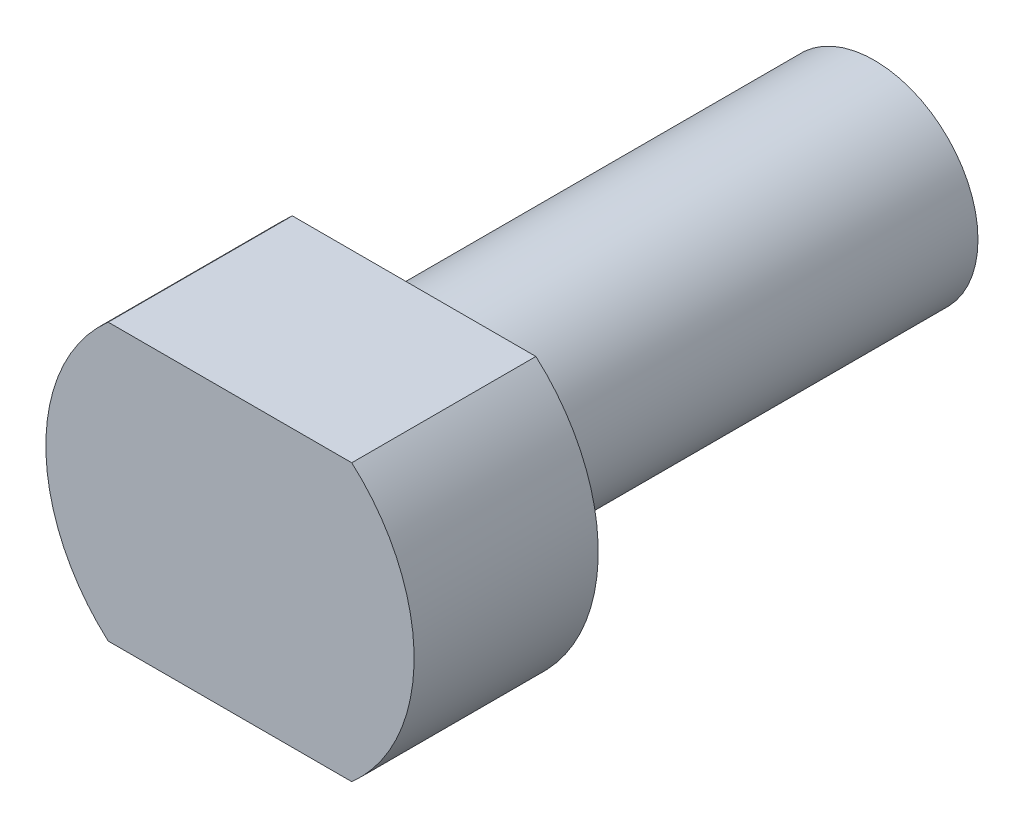
ISO-10303-21;
HEADER;
FILE_DESCRIPTION(('STEP AP214'),'2;1');
FILE_NAME('part.step','',(''),(''),'','','');
FILE_SCHEMA(('AUTOMOTIVE_DESIGN { 1 0 10303 214 1 1 1 1 }'));
ENDSEC;
DATA;
#1=APPLICATION_CONTEXT('core data for automotive mechanical design processes');
#2=APPLICATION_PROTOCOL_DEFINITION('international standard','automotive_design',2000,#1);
#3=PRODUCT_CONTEXT('',#1,'mechanical');
#4=PRODUCT('Part','Part','',(#3));
#5=PRODUCT_RELATED_PRODUCT_CATEGORY('part','',(#4));
#6=PRODUCT_DEFINITION_FORMATION('','',#4);
#7=PRODUCT_DEFINITION_CONTEXT('part definition',#1,'design');
#8=PRODUCT_DEFINITION('design','',#6,#7);
#9=PRODUCT_DEFINITION_SHAPE('','',#8);
#10=(LENGTH_UNIT() NAMED_UNIT(*) SI_UNIT(.MILLI.,.METRE.));
#11=(NAMED_UNIT(*) PLANE_ANGLE_UNIT() SI_UNIT($,.RADIAN.));
#12=(NAMED_UNIT(*) SI_UNIT($,.STERADIAN.) SOLID_ANGLE_UNIT());
#13=UNCERTAINTY_MEASURE_WITH_UNIT(LENGTH_MEASURE(1.E-05),#10,'distance_accuracy_value','');
#14=(GEOMETRIC_REPRESENTATION_CONTEXT(3) GLOBAL_UNCERTAINTY_ASSIGNED_CONTEXT((#13)) GLOBAL_UNIT_ASSIGNED_CONTEXT((#10,
#11,#12)) REPRESENTATION_CONTEXT('',''));
#15=CARTESIAN_POINT('',(0.,0.,0.));
#16=DIRECTION('',(0.,0.,1.));
#17=DIRECTION('',(1.,0.,0.));
#18=AXIS2_PLACEMENT_3D('',#15,#16,#17);
#19=CARTESIAN_POINT('',(0.,0.,14.));
#20=DIRECTION('',(0.,0.,-1.));
#21=DIRECTION('',(-1.,0.,0.));
#22=AXIS2_PLACEMENT_3D('',#19,#20,#21);
#23=CYLINDRICAL_SURFACE('',#22,4.);
#24=CARTESIAN_POINT('',(0.,0.,14.));
#25=DIRECTION('',(0.,0.,1.));
#26=DIRECTION('',(1.,0.,0.));
#27=AXIS2_PLACEMENT_3D('',#24,#25,#26);
#28=CIRCLE('',#27,4.);
#29=CARTESIAN_POINT('',(-2.64575131106459,3.,14.));
#30=VERTEX_POINT('',#29);
#31=CARTESIAN_POINT('',(-2.64575131106459,-3.,14.));
#32=VERTEX_POINT('',#31);
#33=EDGE_CURVE('E91',#30,#32,#28,.T.);
#34=ORIENTED_EDGE('',*,*,#33,.F.);
#35=DIRECTION('',(0.,0.,1.));
#36=VECTOR('',#35,1.);
#37=CARTESIAN_POINT('',(-2.64575131106459,3.,10.));
#38=LINE('',#37,#36);
#39=CARTESIAN_POINT('',(-2.64575131106459,3.,10.));
#40=VERTEX_POINT('',#39);
#41=EDGE_CURVE('E76',#40,#30,#38,.T.);
#42=ORIENTED_EDGE('',*,*,#41,.F.);
#43=CARTESIAN_POINT('',(0.,0.,10.));
#44=DIRECTION('',(0.,0.,1.));
#45=DIRECTION('',(1.,0.,0.));
#46=AXIS2_PLACEMENT_3D('',#43,#44,#45);
#47=CIRCLE('',#46,4.);
#48=CARTESIAN_POINT('',(-2.64575131106459,-3.,10.));
#49=VERTEX_POINT('',#48);
#50=EDGE_CURVE('E98',#40,#49,#47,.T.);
#51=ORIENTED_EDGE('',*,*,#50,.T.);
#52=DIRECTION('',(0.,0.,1.));
#53=VECTOR('',#52,1.);
#54=CARTESIAN_POINT('',(-2.64575131106459,-3.,10.));
#55=LINE('',#54,#53);
#56=EDGE_CURVE('E52',#49,#32,#55,.T.);
#57=ORIENTED_EDGE('',*,*,#56,.T.);
#58=EDGE_LOOP('',(#34,#42,#51,#57));
#59=FACE_BOUND('',#58,.T.);
#60=ADVANCED_FACE('F37',(#59),#23,.T.);
#61=CARTESIAN_POINT('',(0.,0.,10.));
#62=DIRECTION('',(0.,0.,-1.));
#63=DIRECTION('',(-1.,0.,0.));
#64=AXIS2_PLACEMENT_3D('',#61,#62,#63);
#65=CYLINDRICAL_SURFACE('',#64,2.25);
#66=CARTESIAN_POINT('',(0.,0.,10.));
#67=DIRECTION('',(0.,0.,1.));
#68=DIRECTION('',(1.,0.,0.));
#69=AXIS2_PLACEMENT_3D('',#66,#67,#68);
#70=CIRCLE('',#69,2.25);
#71=CARTESIAN_POINT('',(2.25,0.,10.));
#72=VERTEX_POINT('',#71);
#73=EDGE_CURVE('E12',#72,#72,#70,.T.);
#74=ORIENTED_EDGE('',*,*,#73,.F.);
#75=EDGE_LOOP('',(#74));
#76=FACE_BOUND('',#75,.T.);
#77=CARTESIAN_POINT('',(0.,0.,0.));
#78=DIRECTION('',(0.,0.,1.));
#79=DIRECTION('',(1.,0.,0.));
#80=AXIS2_PLACEMENT_3D('',#77,#78,#79);
#81=CIRCLE('',#80,2.25);
#82=CARTESIAN_POINT('',(2.25,0.,0.));
#83=VERTEX_POINT('',#82);
#84=EDGE_CURVE('E41',#83,#83,#81,.T.);
#85=ORIENTED_EDGE('',*,*,#84,.T.);
#86=EDGE_LOOP('',(#85));
#87=FACE_BOUND('',#86,.T.);
#88=ADVANCED_FACE('F39',(#76,#87),#65,.T.);
#89=CARTESIAN_POINT('',(0.,0.,0.));
#90=DIRECTION('',(0.,0.,1.));
#91=DIRECTION('',(1.,0.,0.));
#92=AXIS2_PLACEMENT_3D('',#89,#90,#91);
#93=PLANE('',#92);
#94=ORIENTED_EDGE('',*,*,#84,.F.);
#95=EDGE_LOOP('',(#94));
#96=FACE_BOUND('',#95,.T.);
#97=ADVANCED_FACE('F118',(#96),#93,.F.);
#98=CARTESIAN_POINT('',(2.64575131106459,-3.,10.));
#99=VERTEX_POINT('',#98);
#100=CARTESIAN_POINT('',(2.64575131106459,3.,10.));
#101=VERTEX_POINT('',#100);
#102=EDGE_CURVE('E103',#99,#101,#47,.T.);
#103=ORIENTED_EDGE('',*,*,#102,.T.);
#104=DIRECTION('',(0.,0.,1.));
#105=VECTOR('',#104,1.);
#106=CARTESIAN_POINT('',(2.64575131106459,3.,10.));
#107=LINE('',#106,#105);
#108=CARTESIAN_POINT('',(2.64575131106459,3.,14.));
#109=VERTEX_POINT('',#108);
#110=EDGE_CURVE('E60',#101,#109,#107,.T.);
#111=ORIENTED_EDGE('',*,*,#110,.T.);
#112=CARTESIAN_POINT('',(2.64575131106459,-3.,14.));
#113=VERTEX_POINT('',#112);
#114=EDGE_CURVE('E93',#113,#109,#28,.T.);
#115=ORIENTED_EDGE('',*,*,#114,.F.);
#116=DIRECTION('',(0.,0.,1.));
#117=VECTOR('',#116,1.);
#118=CARTESIAN_POINT('',(2.64575131106459,-3.,10.));
#119=LINE('',#118,#117);
#120=EDGE_CURVE('E111',#99,#113,#119,.T.);
#121=ORIENTED_EDGE('',*,*,#120,.F.);
#122=EDGE_LOOP('',(#103,#111,#115,#121));
#123=FACE_BOUND('',#122,.T.);
#124=ADVANCED_FACE('F116',(#123),#23,.T.);
#125=CARTESIAN_POINT('',(0.,0.,14.));
#126=DIRECTION('',(0.,0.,1.));
#127=DIRECTION('',(1.,0.,0.));
#128=AXIS2_PLACEMENT_3D('',#125,#126,#127);
#129=PLANE('',#128);
#130=DIRECTION('',(1.,0.,0.));
#131=VECTOR('',#130,1.);
#132=CARTESIAN_POINT('',(-2.64575131106459,3.,14.));
#133=LINE('',#132,#131);
#134=EDGE_CURVE('E79',#30,#109,#133,.T.);
#135=ORIENTED_EDGE('',*,*,#134,.F.);
#136=ORIENTED_EDGE('',*,*,#33,.T.);
#137=DIRECTION('',(-1.,0.,0.));
#138=VECTOR('',#137,1.);
#139=CARTESIAN_POINT('',(-2.64575131106459,-3.,14.));
#140=LINE('',#139,#138);
#141=EDGE_CURVE('E94',#113,#32,#140,.T.);
#142=ORIENTED_EDGE('',*,*,#141,.F.);
#143=ORIENTED_EDGE('',*,*,#114,.T.);
#144=EDGE_LOOP('',(#135,#136,#142,#143));
#145=FACE_BOUND('',#144,.T.);
#146=ADVANCED_FACE('F89',(#145),#129,.T.);
#147=CARTESIAN_POINT('',(0.,0.,10.));
#148=DIRECTION('',(0.,0.,1.));
#149=DIRECTION('',(1.,0.,0.));
#150=AXIS2_PLACEMENT_3D('',#147,#148,#149);
#151=PLANE('',#150);
#152=ORIENTED_EDGE('',*,*,#73,.T.);
#153=EDGE_LOOP('',(#152));
#154=FACE_BOUND('',#153,.T.);
#155=ORIENTED_EDGE('',*,*,#50,.F.);
#156=DIRECTION('',(1.,0.,0.));
#157=VECTOR('',#156,1.);
#158=CARTESIAN_POINT('',(-2.64575131106459,3.,10.));
#159=LINE('',#158,#157);
#160=EDGE_CURVE('E80',#40,#101,#159,.T.);
#161=ORIENTED_EDGE('',*,*,#160,.T.);
#162=ORIENTED_EDGE('',*,*,#102,.F.);
#163=DIRECTION('',(-1.,0.,0.));
#164=VECTOR('',#163,1.);
#165=CARTESIAN_POINT('',(-2.64575131106459,-3.,10.));
#166=LINE('',#165,#164);
#167=EDGE_CURVE('E101',#99,#49,#166,.T.);
#168=ORIENTED_EDGE('',*,*,#167,.T.);
#169=EDGE_LOOP('',(#155,#161,#162,#168));
#170=FACE_BOUND('',#169,.T.);
#171=ADVANCED_FACE('F114',(#154,#170),#151,.F.);
#172=CARTESIAN_POINT('',(-2.64575131106459,-3.,10.));
#173=DIRECTION('',(0.,1.,0.));
#174=DIRECTION('',(0.,0.,1.));
#175=AXIS2_PLACEMENT_3D('',#172,#173,#174);
#176=PLANE('',#175);
#177=ORIENTED_EDGE('',*,*,#141,.T.);
#178=ORIENTED_EDGE('',*,*,#56,.F.);
#179=ORIENTED_EDGE('',*,*,#167,.F.);
#180=ORIENTED_EDGE('',*,*,#120,.T.);
#181=EDGE_LOOP('',(#177,#178,#179,#180));
#182=FACE_BOUND('',#181,.T.);
#183=ADVANCED_FACE('F115',(#182),#176,.F.);
#184=CARTESIAN_POINT('',(-2.64575131106459,3.,10.));
#185=DIRECTION('',(0.,-1.,0.));
#186=DIRECTION('',(0.,0.,-1.));
#187=AXIS2_PLACEMENT_3D('',#184,#185,#186);
#188=PLANE('',#187);
#189=ORIENTED_EDGE('',*,*,#134,.T.);
#190=ORIENTED_EDGE('',*,*,#110,.F.);
#191=ORIENTED_EDGE('',*,*,#160,.F.);
#192=ORIENTED_EDGE('',*,*,#41,.T.);
#193=EDGE_LOOP('',(#189,#190,#191,#192));
#194=FACE_BOUND('',#193,.T.);
#195=ADVANCED_FACE('F78',(#194),#188,.F.);
#196=CLOSED_SHELL('',(#60,#88,#97,#124,#146,#171,#183,#195));
#197=MANIFOLD_SOLID_BREP('B2',#196);
#198=ADVANCED_BREP_SHAPE_REPRESENTATION('',(#18,#197),#14);
#199=SHAPE_DEFINITION_REPRESENTATION(#9,#198);
ENDSEC;
END-ISO-10303-21;
